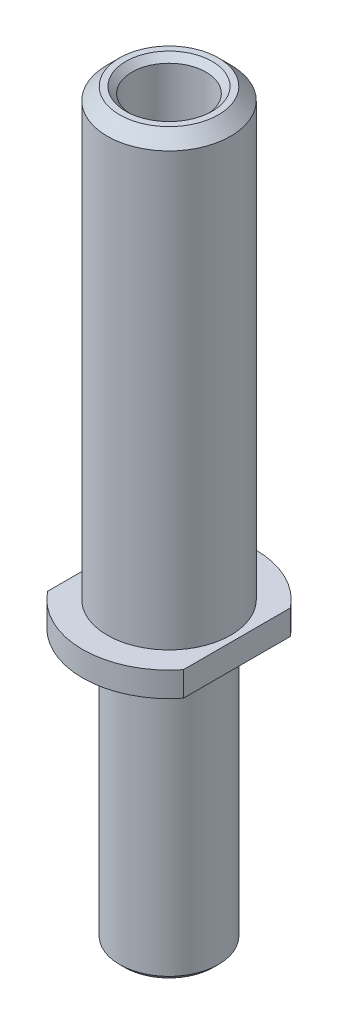
ISO-10303-21;
HEADER;
FILE_DESCRIPTION(('STEP AP214'),'2;1');
FILE_NAME('part.step','',(''),(''),'','','');
FILE_SCHEMA(('AUTOMOTIVE_DESIGN { 1 0 10303 214 1 1 1 1 }'));
ENDSEC;
DATA;
#1=APPLICATION_CONTEXT('core data for automotive mechanical design processes');
#2=APPLICATION_PROTOCOL_DEFINITION('international standard','automotive_design',2000,#1);
#3=PRODUCT_CONTEXT('',#1,'mechanical');
#4=PRODUCT('Part','Part','',(#3));
#5=PRODUCT_RELATED_PRODUCT_CATEGORY('part','',(#4));
#6=PRODUCT_DEFINITION_FORMATION('','',#4);
#7=PRODUCT_DEFINITION_CONTEXT('part definition',#1,'design');
#8=PRODUCT_DEFINITION('design','',#6,#7);
#9=PRODUCT_DEFINITION_SHAPE('','',#8);
#10=(LENGTH_UNIT() NAMED_UNIT(*) SI_UNIT(.MILLI.,.METRE.));
#11=(NAMED_UNIT(*) PLANE_ANGLE_UNIT() SI_UNIT($,.RADIAN.));
#12=(NAMED_UNIT(*) SI_UNIT($,.STERADIAN.) SOLID_ANGLE_UNIT());
#13=UNCERTAINTY_MEASURE_WITH_UNIT(LENGTH_MEASURE(1.E-05),#10,'distance_accuracy_value','');
#14=(GEOMETRIC_REPRESENTATION_CONTEXT(3) GLOBAL_UNCERTAINTY_ASSIGNED_CONTEXT((#13)) GLOBAL_UNIT_ASSIGNED_CONTEXT((#10,
#11,#12)) REPRESENTATION_CONTEXT('',''));
#15=CARTESIAN_POINT('',(0.,0.,0.));
#16=DIRECTION('',(0.,0.,1.));
#17=DIRECTION('',(1.,0.,0.));
#18=AXIS2_PLACEMENT_3D('',#15,#16,#17);
#19=CARTESIAN_POINT('',(0.,12.,3.5));
#20=DIRECTION('',(0.,1.,0.));
#21=DIRECTION('',(0.,0.,1.));
#22=AXIS2_PLACEMENT_3D('',#19,#20,#21);
#23=PLANE('',#22);
#24=CARTESIAN_POINT('',(0.,12.,0.));
#25=DIRECTION('',(0.,1.,0.));
#26=DIRECTION('',(0.,0.,1.));
#27=AXIS2_PLACEMENT_3D('',#24,#25,#26);
#28=CIRCLE('',#27,2.5);
#29=CARTESIAN_POINT('',(0.,12.,2.5));
#30=VERTEX_POINT('',#29);
#31=EDGE_CURVE('E101',#30,#30,#28,.T.);
#32=ORIENTED_EDGE('',*,*,#31,.F.);
#33=EDGE_LOOP('',(#32));
#34=FACE_BOUND('',#33,.T.);
#35=CARTESIAN_POINT('',(0.,12.,0.));
#36=DIRECTION('',(0.,1.,0.));
#37=DIRECTION('',(0.,0.,1.));
#38=AXIS2_PLACEMENT_3D('',#35,#36,#37);
#39=CIRCLE('',#38,3.5);
#40=CARTESIAN_POINT('',(2.75,12.,-2.16506350946109));
#41=VERTEX_POINT('',#40);
#42=CARTESIAN_POINT('',(-2.75,12.,-2.16506350946109));
#43=VERTEX_POINT('',#42);
#44=EDGE_CURVE('E100',#41,#43,#39,.T.);
#45=ORIENTED_EDGE('',*,*,#44,.T.);
#46=DIRECTION('',(0.,0.,-1.));
#47=VECTOR('',#46,1.);
#48=CARTESIAN_POINT('',(-2.75,12.,-2.16506350946109));
#49=LINE('',#48,#47);
#50=CARTESIAN_POINT('',(-2.75,12.,2.16506350946109));
#51=VERTEX_POINT('',#50);
#52=EDGE_CURVE('E79',#51,#43,#49,.T.);
#53=ORIENTED_EDGE('',*,*,#52,.F.);
#54=CARTESIAN_POINT('',(2.75,12.,2.16506350946109));
#55=VERTEX_POINT('',#54);
#56=EDGE_CURVE('E87',#51,#55,#39,.T.);
#57=ORIENTED_EDGE('',*,*,#56,.T.);
#58=DIRECTION('',(0.,0.,1.));
#59=VECTOR('',#58,1.);
#60=CARTESIAN_POINT('',(2.75,12.,-2.16506350946109));
#61=LINE('',#60,#59);
#62=EDGE_CURVE('E257',#41,#55,#61,.T.);
#63=ORIENTED_EDGE('',*,*,#62,.F.);
#64=EDGE_LOOP('',(#45,#53,#57,#63));
#65=FACE_BOUND('',#64,.T.);
#66=ADVANCED_FACE('F32',(#34,#65),#23,.T.);
#67=CARTESIAN_POINT('',(0.,30.,0.));
#68=DIRECTION('',(0.,1.,0.));
#69=DIRECTION('',(0.,0.,1.));
#70=AXIS2_PLACEMENT_3D('',#67,#68,#69);
#71=CYLINDRICAL_SURFACE('',#70,3.5);
#72=ORIENTED_EDGE('',*,*,#56,.F.);
#73=DIRECTION('',(0.,-1.,0.));
#74=VECTOR('',#73,1.);
#75=CARTESIAN_POINT('',(-2.75,30.001,2.16506350946109));
#76=LINE('',#75,#74);
#77=CARTESIAN_POINT('',(-2.75,11.,2.16506350946109));
#78=VERTEX_POINT('',#77);
#79=EDGE_CURVE('E73',#51,#78,#76,.T.);
#80=ORIENTED_EDGE('',*,*,#79,.T.);
#81=CARTESIAN_POINT('',(0.,11.,0.));
#82=DIRECTION('',(0.,1.,0.));
#83=DIRECTION('',(0.,0.,1.));
#84=AXIS2_PLACEMENT_3D('',#81,#82,#83);
#85=CIRCLE('',#84,3.5);
#86=CARTESIAN_POINT('',(2.75,11.,2.16506350946109));
#87=VERTEX_POINT('',#86);
#88=EDGE_CURVE('E85',#78,#87,#85,.T.);
#89=ORIENTED_EDGE('',*,*,#88,.T.);
#90=DIRECTION('',(0.,-1.,0.));
#91=VECTOR('',#90,1.);
#92=CARTESIAN_POINT('',(2.75,30.001,2.16506350946109));
#93=LINE('',#92,#91);
#94=EDGE_CURVE('E55',#55,#87,#93,.T.);
#95=ORIENTED_EDGE('',*,*,#94,.F.);
#96=EDGE_LOOP('',(#72,#80,#89,#95));
#97=FACE_BOUND('',#96,.T.);
#98=ADVANCED_FACE('F84',(#97),#71,.T.);
#99=CARTESIAN_POINT('',(2.75,11.,-2.16506350946109));
#100=VERTEX_POINT('',#99);
#101=CARTESIAN_POINT('',(-2.75,11.,-2.16506350946109));
#102=VERTEX_POINT('',#101);
#103=EDGE_CURVE('E91',#100,#102,#85,.T.);
#104=ORIENTED_EDGE('',*,*,#103,.T.);
#105=DIRECTION('',(0.,-1.,0.));
#106=VECTOR('',#105,1.);
#107=CARTESIAN_POINT('',(-2.75,30.001,-2.16506350946109));
#108=LINE('',#107,#106);
#109=EDGE_CURVE('E47',#43,#102,#108,.T.);
#110=ORIENTED_EDGE('',*,*,#109,.F.);
#111=ORIENTED_EDGE('',*,*,#44,.F.);
#112=DIRECTION('',(0.,-1.,0.));
#113=VECTOR('',#112,1.);
#114=CARTESIAN_POINT('',(2.75,30.001,-2.16506350946109));
#115=LINE('',#114,#113);
#116=EDGE_CURVE('E254',#41,#100,#115,.T.);
#117=ORIENTED_EDGE('',*,*,#116,.T.);
#118=EDGE_LOOP('',(#104,#110,#111,#117));
#119=FACE_BOUND('',#118,.T.);
#120=ADVANCED_FACE('F130',(#119),#71,.T.);
#121=CARTESIAN_POINT('',(0.,11.,2.));
#122=DIRECTION('',(0.,-1.,0.));
#123=DIRECTION('',(0.,0.,-1.));
#124=AXIS2_PLACEMENT_3D('',#121,#122,#123);
#125=PLANE('',#124);
#126=CARTESIAN_POINT('',(0.,11.,0.));
#127=DIRECTION('',(0.,1.,0.));
#128=DIRECTION('',(0.,0.,1.));
#129=AXIS2_PLACEMENT_3D('',#126,#127,#128);
#130=CIRCLE('',#129,2.);
#131=CARTESIAN_POINT('',(0.,11.,2.));
#132=VERTEX_POINT('',#131);
#133=EDGE_CURVE('E92',#132,#132,#130,.T.);
#134=ORIENTED_EDGE('',*,*,#133,.T.);
#135=EDGE_LOOP('',(#134));
#136=FACE_BOUND('',#135,.T.);
#137=ORIENTED_EDGE('',*,*,#88,.F.);
#138=DIRECTION('',(0.,0.,1.));
#139=VECTOR('',#138,1.);
#140=CARTESIAN_POINT('',(-2.75,11.,-2.16506350946109));
#141=LINE('',#140,#139);
#142=EDGE_CURVE('E70',#102,#78,#141,.T.);
#143=ORIENTED_EDGE('',*,*,#142,.F.);
#144=ORIENTED_EDGE('',*,*,#103,.F.);
#145=DIRECTION('',(0.,0.,-1.));
#146=VECTOR('',#145,1.);
#147=CARTESIAN_POINT('',(2.75,11.,-2.16506350946109));
#148=LINE('',#147,#146);
#149=EDGE_CURVE('E90',#87,#100,#148,.T.);
#150=ORIENTED_EDGE('',*,*,#149,.F.);
#151=EDGE_LOOP('',(#137,#143,#144,#150));
#152=FACE_BOUND('',#151,.T.);
#153=ADVANCED_FACE('F89',(#136,#152),#125,.T.);
#154=CARTESIAN_POINT('',(0.,29.75,0.));
#155=DIRECTION('',(0.,1.,0.));
#156=DIRECTION('',(0.,0.,1.));
#157=AXIS2_PLACEMENT_3D('',#154,#155,#156);
#158=CONICAL_SURFACE('',#157,1.5,0.785398163397448);
#159=CARTESIAN_POINT('',(0.,30.,0.));
#160=DIRECTION('',(0.,1.,0.));
#161=DIRECTION('',(0.,0.,1.));
#162=AXIS2_PLACEMENT_3D('',#159,#160,#161);
#163=CIRCLE('',#162,1.75);
#164=CARTESIAN_POINT('',(0.,30.,1.75));
#165=VERTEX_POINT('',#164);
#166=EDGE_CURVE('E11',#165,#165,#163,.T.);
#167=ORIENTED_EDGE('',*,*,#166,.T.);
#168=EDGE_LOOP('',(#167));
#169=FACE_BOUND('',#168,.T.);
#170=CARTESIAN_POINT('',(0.,29.75,0.));
#171=DIRECTION('',(0.,1.,0.));
#172=DIRECTION('',(0.,0.,1.));
#173=AXIS2_PLACEMENT_3D('',#170,#171,#172);
#174=CIRCLE('',#173,1.5);
#175=CARTESIAN_POINT('',(0.,29.75,1.5));
#176=VERTEX_POINT('',#175);
#177=EDGE_CURVE('E263',#176,#176,#174,.T.);
#178=ORIENTED_EDGE('',*,*,#177,.F.);
#179=EDGE_LOOP('',(#178));
#180=FACE_BOUND('',#179,.T.);
#181=ADVANCED_FACE('F34',(#169,#180),#158,.F.);
#182=CARTESIAN_POINT('',(0.,30.,1.75));
#183=DIRECTION('',(0.,1.,0.));
#184=DIRECTION('',(0.,0.,1.));
#185=AXIS2_PLACEMENT_3D('',#182,#183,#184);
#186=PLANE('',#185);
#187=CARTESIAN_POINT('',(0.,30.,0.));
#188=DIRECTION('',(0.,1.,0.));
#189=DIRECTION('',(0.,0.,1.));
#190=AXIS2_PLACEMENT_3D('',#187,#188,#189);
#191=CIRCLE('',#190,2.);
#192=CARTESIAN_POINT('',(0.,30.,2.));
#193=VERTEX_POINT('',#192);
#194=EDGE_CURVE('E40',#193,#193,#191,.T.);
#195=ORIENTED_EDGE('',*,*,#194,.T.);
#196=EDGE_LOOP('',(#195));
#197=FACE_BOUND('',#196,.T.);
#198=ORIENTED_EDGE('',*,*,#166,.F.);
#199=EDGE_LOOP('',(#198));
#200=FACE_BOUND('',#199,.T.);
#201=ADVANCED_FACE('F109',(#197,#200),#186,.T.);
#202=CARTESIAN_POINT('',(0.,30.,0.));
#203=DIRECTION('',(0.,-1.,0.));
#204=DIRECTION('',(0.,0.,-1.));
#205=AXIS2_PLACEMENT_3D('',#202,#203,#204);
#206=CONICAL_SURFACE('',#205,2.,0.785398163397448);
#207=CARTESIAN_POINT('',(0.,29.5,0.));
#208=DIRECTION('',(0.,1.,0.));
#209=DIRECTION('',(0.,0.,1.));
#210=AXIS2_PLACEMENT_3D('',#207,#208,#209);
#211=CIRCLE('',#210,2.5);
#212=CARTESIAN_POINT('',(0.,29.5,2.5));
#213=VERTEX_POINT('',#212);
#214=EDGE_CURVE('E104',#213,#213,#211,.T.);
#215=ORIENTED_EDGE('',*,*,#214,.T.);
#216=EDGE_LOOP('',(#215));
#217=FACE_BOUND('',#216,.T.);
#218=ORIENTED_EDGE('',*,*,#194,.F.);
#219=EDGE_LOOP('',(#218));
#220=FACE_BOUND('',#219,.T.);
#221=ADVANCED_FACE('F112',(#217,#220),#206,.T.);
#222=CARTESIAN_POINT('',(0.,30.,0.));
#223=DIRECTION('',(0.,1.,0.));
#224=DIRECTION('',(0.,0.,1.));
#225=AXIS2_PLACEMENT_3D('',#222,#223,#224);
#226=CYLINDRICAL_SURFACE('',#225,2.5);
#227=ORIENTED_EDGE('',*,*,#31,.T.);
#228=EDGE_LOOP('',(#227));
#229=FACE_BOUND('',#228,.T.);
#230=ORIENTED_EDGE('',*,*,#214,.F.);
#231=EDGE_LOOP('',(#230));
#232=FACE_BOUND('',#231,.T.);
#233=ADVANCED_FACE('F114',(#229,#232),#226,.T.);
#234=CARTESIAN_POINT('',(0.,30.,0.));
#235=DIRECTION('',(0.,1.,0.));
#236=DIRECTION('',(0.,0.,1.));
#237=AXIS2_PLACEMENT_3D('',#234,#235,#236);
#238=CYLINDRICAL_SURFACE('',#237,2.);
#239=CARTESIAN_POINT('',(0.,0.199999999999999,0.));
#240=DIRECTION('',(0.,1.,0.));
#241=DIRECTION('',(0.,0.,1.));
#242=AXIS2_PLACEMENT_3D('',#239,#240,#241);
#243=CIRCLE('',#242,2.);
#244=CARTESIAN_POINT('',(0.,0.199999999999999,2.));
#245=VERTEX_POINT('',#244);
#246=EDGE_CURVE('E95',#245,#245,#243,.T.);
#247=ORIENTED_EDGE('',*,*,#246,.T.);
#248=EDGE_LOOP('',(#247));
#249=FACE_BOUND('',#248,.T.);
#250=ORIENTED_EDGE('',*,*,#133,.F.);
#251=EDGE_LOOP('',(#250));
#252=FACE_BOUND('',#251,.T.);
#253=ADVANCED_FACE('F121',(#249,#252),#238,.T.);
#254=CARTESIAN_POINT('',(0.,0.199999999999999,0.));
#255=DIRECTION('',(0.,1.,0.));
#256=DIRECTION('',(0.,0.,1.));
#257=AXIS2_PLACEMENT_3D('',#254,#255,#256);
#258=CONICAL_SURFACE('',#257,2.,0.785398163397452);
#259=CARTESIAN_POINT('',(0.,0.,0.));
#260=DIRECTION('',(0.,1.,0.));
#261=DIRECTION('',(0.,0.,1.));
#262=AXIS2_PLACEMENT_3D('',#259,#260,#261);
#263=CIRCLE('',#262,1.8);
#264=CARTESIAN_POINT('',(0.,0.,1.8));
#265=VERTEX_POINT('',#264);
#266=EDGE_CURVE('E272',#265,#265,#263,.T.);
#267=ORIENTED_EDGE('',*,*,#266,.T.);
#268=EDGE_LOOP('',(#267));
#269=FACE_BOUND('',#268,.T.);
#270=ORIENTED_EDGE('',*,*,#246,.F.);
#271=EDGE_LOOP('',(#270));
#272=FACE_BOUND('',#271,.T.);
#273=ADVANCED_FACE('F140',(#269,#272),#258,.T.);
#274=CARTESIAN_POINT('',(0.,0.,1.7));
#275=DIRECTION('',(0.,-1.,0.));
#276=DIRECTION('',(0.,0.,-1.));
#277=AXIS2_PLACEMENT_3D('',#274,#275,#276);
#278=PLANE('',#277);
#279=CARTESIAN_POINT('',(0.,0.,0.));
#280=DIRECTION('',(0.,1.,0.));
#281=DIRECTION('',(0.,0.,1.));
#282=AXIS2_PLACEMENT_3D('',#279,#280,#281);
#283=CIRCLE('',#282,1.7);
#284=CARTESIAN_POINT('',(0.,0.,1.7));
#285=VERTEX_POINT('',#284);
#286=EDGE_CURVE('E269',#285,#285,#283,.T.);
#287=ORIENTED_EDGE('',*,*,#286,.T.);
#288=EDGE_LOOP('',(#287));
#289=FACE_BOUND('',#288,.T.);
#290=ORIENTED_EDGE('',*,*,#266,.F.);
#291=EDGE_LOOP('',(#290));
#292=FACE_BOUND('',#291,.T.);
#293=ADVANCED_FACE('F144',(#289,#292),#278,.T.);
#294=CARTESIAN_POINT('',(0.,0.,0.));
#295=DIRECTION('',(0.,-1.,0.));
#296=DIRECTION('',(0.,0.,-1.));
#297=AXIS2_PLACEMENT_3D('',#294,#295,#296);
#298=CONICAL_SURFACE('',#297,1.7,0.785398163397452);
#299=CARTESIAN_POINT('',(0.,0.199999999999999,0.));
#300=DIRECTION('',(0.,1.,0.));
#301=DIRECTION('',(0.,0.,1.));
#302=AXIS2_PLACEMENT_3D('',#299,#300,#301);
#303=CIRCLE('',#302,1.5);
#304=CARTESIAN_POINT('',(0.,0.199999999999999,1.5));
#305=VERTEX_POINT('',#304);
#306=EDGE_CURVE('E266',#305,#305,#303,.T.);
#307=ORIENTED_EDGE('',*,*,#306,.T.);
#308=EDGE_LOOP('',(#307));
#309=FACE_BOUND('',#308,.T.);
#310=ORIENTED_EDGE('',*,*,#286,.F.);
#311=EDGE_LOOP('',(#310));
#312=FACE_BOUND('',#311,.T.);
#313=ADVANCED_FACE('F148',(#309,#312),#298,.F.);
#314=CARTESIAN_POINT('',(0.,30.,0.));
#315=DIRECTION('',(0.,1.,0.));
#316=DIRECTION('',(0.,0.,1.));
#317=AXIS2_PLACEMENT_3D('',#314,#315,#316);
#318=CYLINDRICAL_SURFACE('',#317,1.5);
#319=ORIENTED_EDGE('',*,*,#177,.T.);
#320=EDGE_LOOP('',(#319));
#321=FACE_BOUND('',#320,.T.);
#322=ORIENTED_EDGE('',*,*,#306,.F.);
#323=EDGE_LOOP('',(#322));
#324=FACE_BOUND('',#323,.T.);
#325=ADVANCED_FACE('F152',(#321,#324),#318,.F.);
#326=CARTESIAN_POINT('',(2.75,30.001,-2.16506350946109));
#327=DIRECTION('',(1.,0.,0.));
#328=DIRECTION('',(0.,0.,-1.));
#329=AXIS2_PLACEMENT_3D('',#326,#327,#328);
#330=PLANE('',#329);
#331=ORIENTED_EDGE('',*,*,#62,.T.);
#332=ORIENTED_EDGE('',*,*,#94,.T.);
#333=ORIENTED_EDGE('',*,*,#149,.T.);
#334=ORIENTED_EDGE('',*,*,#116,.F.);
#335=EDGE_LOOP('',(#331,#332,#333,#334));
#336=FACE_BOUND('',#335,.T.);
#337=ADVANCED_FACE('F156',(#336),#330,.T.);
#338=CARTESIAN_POINT('',(-2.75,30.001,-2.16506350946109));
#339=DIRECTION('',(-1.,0.,0.));
#340=DIRECTION('',(0.,0.,1.));
#341=AXIS2_PLACEMENT_3D('',#338,#339,#340);
#342=PLANE('',#341);
#343=ORIENTED_EDGE('',*,*,#52,.T.);
#344=ORIENTED_EDGE('',*,*,#109,.T.);
#345=ORIENTED_EDGE('',*,*,#142,.T.);
#346=ORIENTED_EDGE('',*,*,#79,.F.);
#347=EDGE_LOOP('',(#343,#344,#345,#346));
#348=FACE_BOUND('',#347,.T.);
#349=ADVANCED_FACE('F72',(#348),#342,.T.);
#350=CLOSED_SHELL('',(#66,#98,#120,#153,#181,#201,#221,#233,#253,#273,#293,#313,#325,#337,#349));
#351=MANIFOLD_SOLID_BREP('B2',#350);
#352=ADVANCED_BREP_SHAPE_REPRESENTATION('',(#18,#351),#14);
#353=SHAPE_DEFINITION_REPRESENTATION(#9,#352);
ENDSEC;
END-ISO-10303-21;
